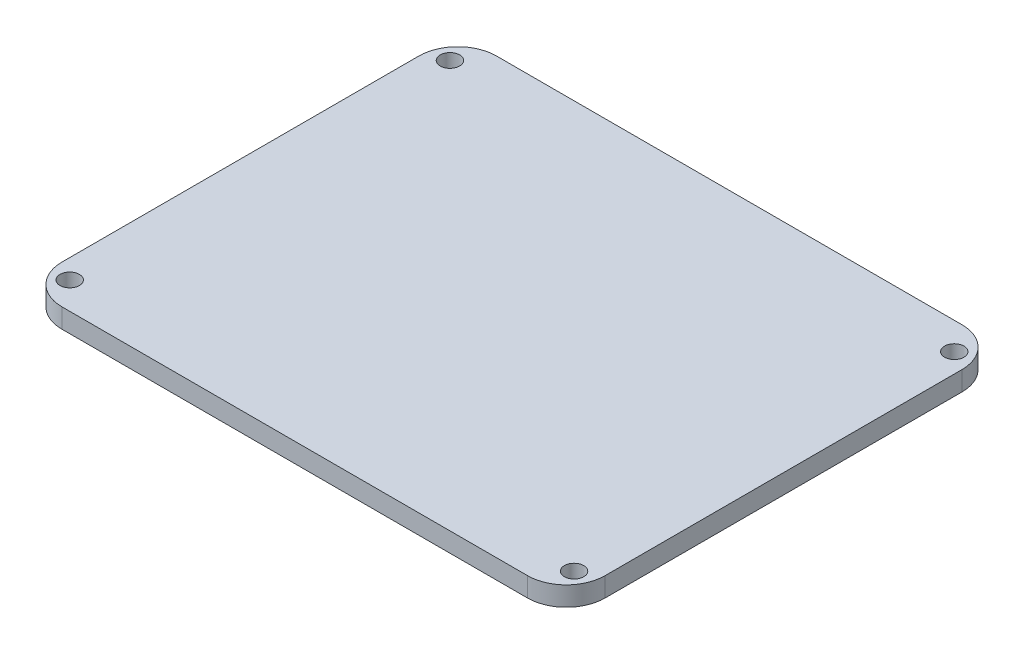
ISO-10303-21;
HEADER;
FILE_DESCRIPTION(('STEP AP214'),'2;1');
FILE_NAME('part.step','',(''),(''),'','','');
FILE_SCHEMA(('AUTOMOTIVE_DESIGN { 1 0 10303 214 1 1 1 1 }'));
ENDSEC;
DATA;
#1=APPLICATION_CONTEXT('core data for automotive mechanical design processes');
#2=APPLICATION_PROTOCOL_DEFINITION('international standard','automotive_design',2000,#1);
#3=PRODUCT_CONTEXT('',#1,'mechanical');
#4=PRODUCT('Part','Part','',(#3));
#5=PRODUCT_RELATED_PRODUCT_CATEGORY('part','',(#4));
#6=PRODUCT_DEFINITION_FORMATION('','',#4);
#7=PRODUCT_DEFINITION_CONTEXT('part definition',#1,'design');
#8=PRODUCT_DEFINITION('design','',#6,#7);
#9=PRODUCT_DEFINITION_SHAPE('','',#8);
#10=(LENGTH_UNIT() NAMED_UNIT(*) SI_UNIT(.MILLI.,.METRE.));
#11=(NAMED_UNIT(*) PLANE_ANGLE_UNIT() SI_UNIT($,.RADIAN.));
#12=(NAMED_UNIT(*) SI_UNIT($,.STERADIAN.) SOLID_ANGLE_UNIT());
#13=UNCERTAINTY_MEASURE_WITH_UNIT(LENGTH_MEASURE(1.E-05),#10,'distance_accuracy_value','');
#14=(GEOMETRIC_REPRESENTATION_CONTEXT(3) GLOBAL_UNCERTAINTY_ASSIGNED_CONTEXT((#13)) GLOBAL_UNIT_ASSIGNED_CONTEXT((#10,
#11,#12)) REPRESENTATION_CONTEXT('',''));
#15=CARTESIAN_POINT('',(0.,0.,0.));
#16=DIRECTION('',(0.,0.,1.));
#17=DIRECTION('',(1.,0.,0.));
#18=AXIS2_PLACEMENT_3D('',#15,#16,#17);
#19=CARTESIAN_POINT('',(-30.,2.5,-23.));
#20=DIRECTION('',(0.,1.,0.));
#21=DIRECTION('',(0.,0.,1.));
#22=AXIS2_PLACEMENT_3D('',#19,#20,#21);
#23=PLANE('',#22);
#24=CARTESIAN_POINT('',(32.5,2.5,24.5));
#25=DIRECTION('',(0.,1.,0.));
#26=DIRECTION('',(0.,0.,1.));
#27=AXIS2_PLACEMENT_3D('',#24,#25,#26);
#28=CIRCLE('',#27,1.25);
#29=CARTESIAN_POINT('',(32.5,2.5,25.75));
#30=VERTEX_POINT('',#29);
#31=EDGE_CURVE('E190',#30,#30,#28,.T.);
#32=ORIENTED_EDGE('',*,*,#31,.F.);
#33=EDGE_LOOP('',(#32));
#34=FACE_BOUND('',#33,.T.);
#35=CARTESIAN_POINT('',(-32.5,2.5,-24.5));
#36=DIRECTION('',(0.,1.,0.));
#37=DIRECTION('',(0.,0.,1.));
#38=AXIS2_PLACEMENT_3D('',#35,#36,#37);
#39=CIRCLE('',#38,1.25);
#40=CARTESIAN_POINT('',(-32.5,2.5,-23.25));
#41=VERTEX_POINT('',#40);
#42=EDGE_CURVE('E136',#41,#41,#39,.T.);
#43=ORIENTED_EDGE('',*,*,#42,.F.);
#44=EDGE_LOOP('',(#43));
#45=FACE_BOUND('',#44,.T.);
#46=CARTESIAN_POINT('',(-30.,2.5,-23.));
#47=DIRECTION('',(0.,1.,0.));
#48=DIRECTION('',(0.,0.,1.));
#49=AXIS2_PLACEMENT_3D('',#46,#47,#48);
#50=CIRCLE('',#49,5.);
#51=CARTESIAN_POINT('',(-30.,2.5,-28.));
#52=VERTEX_POINT('',#51);
#53=CARTESIAN_POINT('',(-35.,2.5,-23.));
#54=VERTEX_POINT('',#53);
#55=EDGE_CURVE('E147',#52,#54,#50,.T.);
#56=ORIENTED_EDGE('',*,*,#55,.T.);
#57=DIRECTION('',(0.,0.,1.));
#58=VECTOR('',#57,1.);
#59=CARTESIAN_POINT('',(-35.,2.5,-23.));
#60=LINE('',#59,#58);
#61=CARTESIAN_POINT('',(-35.,2.5,23.));
#62=VERTEX_POINT('',#61);
#63=EDGE_CURVE('E95',#54,#62,#60,.T.);
#64=ORIENTED_EDGE('',*,*,#63,.T.);
#65=CARTESIAN_POINT('',(-30.,2.5,23.));
#66=DIRECTION('',(0.,1.,0.));
#67=DIRECTION('',(0.,0.,1.));
#68=AXIS2_PLACEMENT_3D('',#65,#66,#67);
#69=CIRCLE('',#68,5.);
#70=CARTESIAN_POINT('',(-30.,2.5,28.));
#71=VERTEX_POINT('',#70);
#72=EDGE_CURVE('E162',#62,#71,#69,.T.);
#73=ORIENTED_EDGE('',*,*,#72,.T.);
#74=DIRECTION('',(1.,0.,0.));
#75=VECTOR('',#74,1.);
#76=CARTESIAN_POINT('',(-30.,2.5,28.));
#77=LINE('',#76,#75);
#78=CARTESIAN_POINT('',(30.,2.5,28.));
#79=VERTEX_POINT('',#78);
#80=EDGE_CURVE('E175',#71,#79,#77,.T.);
#81=ORIENTED_EDGE('',*,*,#80,.T.);
#82=CARTESIAN_POINT('',(30.,2.5,23.));
#83=DIRECTION('',(0.,1.,0.));
#84=DIRECTION('',(0.,0.,-1.));
#85=AXIS2_PLACEMENT_3D('',#82,#83,#84);
#86=CIRCLE('',#85,5.);
#87=CARTESIAN_POINT('',(35.,2.5,23.));
#88=VERTEX_POINT('',#87);
#89=EDGE_CURVE('E114',#79,#88,#86,.T.);
#90=ORIENTED_EDGE('',*,*,#89,.T.);
#91=DIRECTION('',(0.,0.,-1.));
#92=VECTOR('',#91,1.);
#93=CARTESIAN_POINT('',(35.,2.5,-23.));
#94=LINE('',#93,#92);
#95=CARTESIAN_POINT('',(35.,2.5,-23.));
#96=VERTEX_POINT('',#95);
#97=EDGE_CURVE('E108',#88,#96,#94,.T.);
#98=ORIENTED_EDGE('',*,*,#97,.T.);
#99=CARTESIAN_POINT('',(30.,2.5,-23.));
#100=DIRECTION('',(0.,1.,0.));
#101=DIRECTION('',(0.,0.,1.));
#102=AXIS2_PLACEMENT_3D('',#99,#100,#101);
#103=CIRCLE('',#102,5.);
#104=CARTESIAN_POINT('',(30.,2.5,-28.));
#105=VERTEX_POINT('',#104);
#106=EDGE_CURVE('E112',#96,#105,#103,.T.);
#107=ORIENTED_EDGE('',*,*,#106,.T.);
#108=DIRECTION('',(-1.,0.,0.));
#109=VECTOR('',#108,1.);
#110=CARTESIAN_POINT('',(-30.,2.5,-28.));
#111=LINE('',#110,#109);
#112=EDGE_CURVE('E52',#105,#52,#111,.T.);
#113=ORIENTED_EDGE('',*,*,#112,.T.);
#114=EDGE_LOOP('',(#56,#64,#73,#81,#90,#98,#107,#113));
#115=FACE_BOUND('',#114,.T.);
#116=CARTESIAN_POINT('',(32.5,2.5,-24.5));
#117=DIRECTION('',(0.,1.,0.));
#118=DIRECTION('',(0.,0.,1.));
#119=AXIS2_PLACEMENT_3D('',#116,#117,#118);
#120=CIRCLE('',#119,1.25);
#121=CARTESIAN_POINT('',(32.5,2.5,-23.25));
#122=VERTEX_POINT('',#121);
#123=EDGE_CURVE('E184',#122,#122,#120,.T.);
#124=ORIENTED_EDGE('',*,*,#123,.F.);
#125=EDGE_LOOP('',(#124));
#126=FACE_BOUND('',#125,.T.);
#127=CARTESIAN_POINT('',(-32.5,2.5,24.5));
#128=DIRECTION('',(0.,1.,0.));
#129=DIRECTION('',(0.,0.,1.));
#130=AXIS2_PLACEMENT_3D('',#127,#128,#129);
#131=CIRCLE('',#130,1.25);
#132=CARTESIAN_POINT('',(-32.5,2.5,25.75));
#133=VERTEX_POINT('',#132);
#134=EDGE_CURVE('E196',#133,#133,#131,.T.);
#135=ORIENTED_EDGE('',*,*,#134,.F.);
#136=EDGE_LOOP('',(#135));
#137=FACE_BOUND('',#136,.T.);
#138=ADVANCED_FACE('F35',(#34,#45,#115,#126,#137),#23,.T.);
#139=CARTESIAN_POINT('',(-30.,0.,-23.));
#140=DIRECTION('',(0.,1.,0.));
#141=DIRECTION('',(0.,0.,1.));
#142=AXIS2_PLACEMENT_3D('',#139,#140,#141);
#143=PLANE('',#142);
#144=CARTESIAN_POINT('',(-30.,0.,-23.));
#145=DIRECTION('',(0.,1.,0.));
#146=DIRECTION('',(0.,0.,1.));
#147=AXIS2_PLACEMENT_3D('',#144,#145,#146);
#148=CIRCLE('',#147,5.);
#149=CARTESIAN_POINT('',(-30.,0.,-28.));
#150=VERTEX_POINT('',#149);
#151=CARTESIAN_POINT('',(-35.,0.,-23.));
#152=VERTEX_POINT('',#151);
#153=EDGE_CURVE('E132',#150,#152,#148,.T.);
#154=ORIENTED_EDGE('',*,*,#153,.F.);
#155=DIRECTION('',(-1.,0.,0.));
#156=VECTOR('',#155,1.);
#157=CARTESIAN_POINT('',(-30.,0.,-28.));
#158=LINE('',#157,#156);
#159=CARTESIAN_POINT('',(30.,0.,-28.));
#160=VERTEX_POINT('',#159);
#161=EDGE_CURVE('E87',#160,#150,#158,.T.);
#162=ORIENTED_EDGE('',*,*,#161,.F.);
#163=CARTESIAN_POINT('',(30.,0.,-23.));
#164=DIRECTION('',(0.,1.,0.));
#165=DIRECTION('',(0.,0.,1.));
#166=AXIS2_PLACEMENT_3D('',#163,#164,#165);
#167=CIRCLE('',#166,5.);
#168=CARTESIAN_POINT('',(35.,0.,-23.));
#169=VERTEX_POINT('',#168);
#170=EDGE_CURVE('E81',#169,#160,#167,.T.);
#171=ORIENTED_EDGE('',*,*,#170,.F.);
#172=DIRECTION('',(0.,0.,-1.));
#173=VECTOR('',#172,1.);
#174=CARTESIAN_POINT('',(35.,0.,-23.));
#175=LINE('',#174,#173);
#176=CARTESIAN_POINT('',(35.,0.,23.));
#177=VERTEX_POINT('',#176);
#178=EDGE_CURVE('E122',#177,#169,#175,.T.);
#179=ORIENTED_EDGE('',*,*,#178,.F.);
#180=CARTESIAN_POINT('',(30.,0.,23.));
#181=DIRECTION('',(0.,1.,0.));
#182=DIRECTION('',(0.,0.,-1.));
#183=AXIS2_PLACEMENT_3D('',#180,#181,#182);
#184=CIRCLE('',#183,5.);
#185=CARTESIAN_POINT('',(30.,0.,28.));
#186=VERTEX_POINT('',#185);
#187=EDGE_CURVE('E142',#186,#177,#184,.T.);
#188=ORIENTED_EDGE('',*,*,#187,.F.);
#189=DIRECTION('',(1.,0.,0.));
#190=VECTOR('',#189,1.);
#191=CARTESIAN_POINT('',(-30.,0.,28.));
#192=LINE('',#191,#190);
#193=CARTESIAN_POINT('',(-30.,0.,28.));
#194=VERTEX_POINT('',#193);
#195=EDGE_CURVE('E140',#194,#186,#192,.T.);
#196=ORIENTED_EDGE('',*,*,#195,.F.);
#197=CARTESIAN_POINT('',(-30.,0.,23.));
#198=DIRECTION('',(0.,1.,0.));
#199=DIRECTION('',(0.,0.,1.));
#200=AXIS2_PLACEMENT_3D('',#197,#198,#199);
#201=CIRCLE('',#200,5.);
#202=CARTESIAN_POINT('',(-35.,0.,23.));
#203=VERTEX_POINT('',#202);
#204=EDGE_CURVE('E138',#203,#194,#201,.T.);
#205=ORIENTED_EDGE('',*,*,#204,.F.);
#206=DIRECTION('',(0.,0.,1.));
#207=VECTOR('',#206,1.);
#208=CARTESIAN_POINT('',(-35.,0.,-23.));
#209=LINE('',#208,#207);
#210=EDGE_CURVE('E135',#152,#203,#209,.T.);
#211=ORIENTED_EDGE('',*,*,#210,.F.);
#212=EDGE_LOOP('',(#154,#162,#171,#179,#188,#196,#205,#211));
#213=FACE_BOUND('',#212,.T.);
#214=CARTESIAN_POINT('',(-32.5,0.,-24.5));
#215=DIRECTION('',(0.,1.,0.));
#216=DIRECTION('',(0.,0.,1.));
#217=AXIS2_PLACEMENT_3D('',#214,#215,#216);
#218=CIRCLE('',#217,1.25);
#219=CARTESIAN_POINT('',(-32.5,0.,-23.25));
#220=VERTEX_POINT('',#219);
#221=EDGE_CURVE('E181',#220,#220,#218,.T.);
#222=ORIENTED_EDGE('',*,*,#221,.T.);
#223=EDGE_LOOP('',(#222));
#224=FACE_BOUND('',#223,.T.);
#225=CARTESIAN_POINT('',(32.5,0.,-24.5));
#226=DIRECTION('',(0.,1.,0.));
#227=DIRECTION('',(0.,0.,1.));
#228=AXIS2_PLACEMENT_3D('',#225,#226,#227);
#229=CIRCLE('',#228,1.25);
#230=CARTESIAN_POINT('',(32.5,0.,-23.25));
#231=VERTEX_POINT('',#230);
#232=EDGE_CURVE('E187',#231,#231,#229,.T.);
#233=ORIENTED_EDGE('',*,*,#232,.T.);
#234=EDGE_LOOP('',(#233));
#235=FACE_BOUND('',#234,.T.);
#236=CARTESIAN_POINT('',(32.5,0.,24.5));
#237=DIRECTION('',(0.,1.,0.));
#238=DIRECTION('',(0.,0.,1.));
#239=AXIS2_PLACEMENT_3D('',#236,#237,#238);
#240=CIRCLE('',#239,1.25);
#241=CARTESIAN_POINT('',(32.5,0.,25.75));
#242=VERTEX_POINT('',#241);
#243=EDGE_CURVE('E193',#242,#242,#240,.T.);
#244=ORIENTED_EDGE('',*,*,#243,.T.);
#245=EDGE_LOOP('',(#244));
#246=FACE_BOUND('',#245,.T.);
#247=CARTESIAN_POINT('',(-32.5,0.,24.5));
#248=DIRECTION('',(0.,1.,0.));
#249=DIRECTION('',(0.,0.,1.));
#250=AXIS2_PLACEMENT_3D('',#247,#248,#249);
#251=CIRCLE('',#250,1.25);
#252=CARTESIAN_POINT('',(-32.5,0.,25.75));
#253=VERTEX_POINT('',#252);
#254=EDGE_CURVE('E199',#253,#253,#251,.T.);
#255=ORIENTED_EDGE('',*,*,#254,.T.);
#256=EDGE_LOOP('',(#255));
#257=FACE_BOUND('',#256,.T.);
#258=ADVANCED_FACE('F166',(#213,#224,#235,#246,#257),#143,.F.);
#259=CARTESIAN_POINT('',(-30.,2.5,-23.));
#260=DIRECTION('',(0.,-1.,0.));
#261=DIRECTION('',(0.,0.,-1.));
#262=AXIS2_PLACEMENT_3D('',#259,#260,#261);
#263=CYLINDRICAL_SURFACE('',#262,5.);
#264=ORIENTED_EDGE('',*,*,#153,.T.);
#265=DIRECTION('',(0.,-1.,0.));
#266=VECTOR('',#265,1.);
#267=CARTESIAN_POINT('',(-35.,2.5,-23.));
#268=LINE('',#267,#266);
#269=EDGE_CURVE('E11',#54,#152,#268,.T.);
#270=ORIENTED_EDGE('',*,*,#269,.F.);
#271=ORIENTED_EDGE('',*,*,#55,.F.);
#272=DIRECTION('',(0.,-1.,0.));
#273=VECTOR('',#272,1.);
#274=CARTESIAN_POINT('',(-30.,2.5,-28.));
#275=LINE('',#274,#273);
#276=EDGE_CURVE('E128',#52,#150,#275,.T.);
#277=ORIENTED_EDGE('',*,*,#276,.T.);
#278=EDGE_LOOP('',(#264,#270,#271,#277));
#279=FACE_BOUND('',#278,.T.);
#280=ADVANCED_FACE('F37',(#279),#263,.T.);
#281=CARTESIAN_POINT('',(-35.,2.5,-23.));
#282=DIRECTION('',(1.,0.,0.));
#283=DIRECTION('',(0.,0.,-1.));
#284=AXIS2_PLACEMENT_3D('',#281,#282,#283);
#285=PLANE('',#284);
#286=ORIENTED_EDGE('',*,*,#210,.T.);
#287=DIRECTION('',(0.,-1.,0.));
#288=VECTOR('',#287,1.);
#289=CARTESIAN_POINT('',(-35.,2.5,23.));
#290=LINE('',#289,#288);
#291=EDGE_CURVE('E44',#62,#203,#290,.T.);
#292=ORIENTED_EDGE('',*,*,#291,.F.);
#293=ORIENTED_EDGE('',*,*,#63,.F.);
#294=ORIENTED_EDGE('',*,*,#269,.T.);
#295=EDGE_LOOP('',(#286,#292,#293,#294));
#296=FACE_BOUND('',#295,.T.);
#297=ADVANCED_FACE('F233',(#296),#285,.F.);
#298=CARTESIAN_POINT('',(-30.,2.5,23.));
#299=DIRECTION('',(0.,-1.,0.));
#300=DIRECTION('',(0.,0.,-1.));
#301=AXIS2_PLACEMENT_3D('',#298,#299,#300);
#302=CYLINDRICAL_SURFACE('',#301,5.);
#303=ORIENTED_EDGE('',*,*,#204,.T.);
#304=DIRECTION('',(0.,-1.,0.));
#305=VECTOR('',#304,1.);
#306=CARTESIAN_POINT('',(-30.,2.5,28.));
#307=LINE('',#306,#305);
#308=EDGE_CURVE('E154',#71,#194,#307,.T.);
#309=ORIENTED_EDGE('',*,*,#308,.F.);
#310=ORIENTED_EDGE('',*,*,#72,.F.);
#311=ORIENTED_EDGE('',*,*,#291,.T.);
#312=EDGE_LOOP('',(#303,#309,#310,#311));
#313=FACE_BOUND('',#312,.T.);
#314=ADVANCED_FACE('F160',(#313),#302,.T.);
#315=CARTESIAN_POINT('',(-30.,2.5,28.));
#316=DIRECTION('',(0.,0.,-1.));
#317=DIRECTION('',(-1.,0.,0.));
#318=AXIS2_PLACEMENT_3D('',#315,#316,#317);
#319=PLANE('',#318);
#320=ORIENTED_EDGE('',*,*,#195,.T.);
#321=DIRECTION('',(0.,-1.,0.));
#322=VECTOR('',#321,1.);
#323=CARTESIAN_POINT('',(30.,2.5,28.));
#324=LINE('',#323,#322);
#325=EDGE_CURVE('E151',#79,#186,#324,.T.);
#326=ORIENTED_EDGE('',*,*,#325,.F.);
#327=ORIENTED_EDGE('',*,*,#80,.F.);
#328=ORIENTED_EDGE('',*,*,#308,.T.);
#329=EDGE_LOOP('',(#320,#326,#327,#328));
#330=FACE_BOUND('',#329,.T.);
#331=ADVANCED_FACE('F171',(#330),#319,.F.);
#332=CARTESIAN_POINT('',(30.,2.5,23.));
#333=DIRECTION('',(0.,-1.,0.));
#334=DIRECTION('',(0.,0.,-1.));
#335=AXIS2_PLACEMENT_3D('',#332,#333,#334);
#336=CYLINDRICAL_SURFACE('',#335,5.);
#337=ORIENTED_EDGE('',*,*,#187,.T.);
#338=DIRECTION('',(0.,-1.,0.));
#339=VECTOR('',#338,1.);
#340=CARTESIAN_POINT('',(35.,2.5,23.));
#341=LINE('',#340,#339);
#342=EDGE_CURVE('E123',#88,#177,#341,.T.);
#343=ORIENTED_EDGE('',*,*,#342,.F.);
#344=ORIENTED_EDGE('',*,*,#89,.F.);
#345=ORIENTED_EDGE('',*,*,#325,.T.);
#346=EDGE_LOOP('',(#337,#343,#344,#345));
#347=FACE_BOUND('',#346,.T.);
#348=ADVANCED_FACE('F174',(#347),#336,.T.);
#349=CARTESIAN_POINT('',(35.,2.5,-23.));
#350=DIRECTION('',(-1.,0.,0.));
#351=DIRECTION('',(0.,0.,1.));
#352=AXIS2_PLACEMENT_3D('',#349,#350,#351);
#353=PLANE('',#352);
#354=ORIENTED_EDGE('',*,*,#178,.T.);
#355=DIRECTION('',(0.,-1.,0.));
#356=VECTOR('',#355,1.);
#357=CARTESIAN_POINT('',(35.,2.5,-23.));
#358=LINE('',#357,#356);
#359=EDGE_CURVE('E119',#96,#169,#358,.T.);
#360=ORIENTED_EDGE('',*,*,#359,.F.);
#361=ORIENTED_EDGE('',*,*,#97,.F.);
#362=ORIENTED_EDGE('',*,*,#342,.T.);
#363=EDGE_LOOP('',(#354,#360,#361,#362));
#364=FACE_BOUND('',#363,.T.);
#365=ADVANCED_FACE('F120',(#364),#353,.F.);
#366=CARTESIAN_POINT('',(30.,2.5,-23.));
#367=DIRECTION('',(0.,-1.,0.));
#368=DIRECTION('',(0.,0.,-1.));
#369=AXIS2_PLACEMENT_3D('',#366,#367,#368);
#370=CYLINDRICAL_SURFACE('',#369,5.);
#371=ORIENTED_EDGE('',*,*,#170,.T.);
#372=DIRECTION('',(0.,-1.,0.));
#373=VECTOR('',#372,1.);
#374=CARTESIAN_POINT('',(30.,2.5,-28.));
#375=LINE('',#374,#373);
#376=EDGE_CURVE('E124',#105,#160,#375,.T.);
#377=ORIENTED_EDGE('',*,*,#376,.F.);
#378=ORIENTED_EDGE('',*,*,#106,.F.);
#379=ORIENTED_EDGE('',*,*,#359,.T.);
#380=EDGE_LOOP('',(#371,#377,#378,#379));
#381=FACE_BOUND('',#380,.T.);
#382=ADVANCED_FACE('F126',(#381),#370,.T.);
#383=CARTESIAN_POINT('',(-30.,2.5,-28.));
#384=DIRECTION('',(0.,0.,1.));
#385=DIRECTION('',(1.,0.,0.));
#386=AXIS2_PLACEMENT_3D('',#383,#384,#385);
#387=PLANE('',#386);
#388=ORIENTED_EDGE('',*,*,#161,.T.);
#389=ORIENTED_EDGE('',*,*,#276,.F.);
#390=ORIENTED_EDGE('',*,*,#112,.F.);
#391=ORIENTED_EDGE('',*,*,#376,.T.);
#392=EDGE_LOOP('',(#388,#389,#390,#391));
#393=FACE_BOUND('',#392,.T.);
#394=ADVANCED_FACE('F221',(#393),#387,.F.);
#395=CARTESIAN_POINT('',(-32.5,2.5,-24.5));
#396=DIRECTION('',(0.,-1.,0.));
#397=DIRECTION('',(0.,0.,-1.));
#398=AXIS2_PLACEMENT_3D('',#395,#396,#397);
#399=CYLINDRICAL_SURFACE('',#398,1.25);
#400=ORIENTED_EDGE('',*,*,#42,.T.);
#401=EDGE_LOOP('',(#400));
#402=FACE_BOUND('',#401,.T.);
#403=ORIENTED_EDGE('',*,*,#221,.F.);
#404=EDGE_LOOP('',(#403));
#405=FACE_BOUND('',#404,.T.);
#406=ADVANCED_FACE('F218',(#402,#405),#399,.F.);
#407=CARTESIAN_POINT('',(32.5,2.5,-24.5));
#408=DIRECTION('',(0.,-1.,0.));
#409=DIRECTION('',(0.,0.,-1.));
#410=AXIS2_PLACEMENT_3D('',#407,#408,#409);
#411=CYLINDRICAL_SURFACE('',#410,1.25);
#412=ORIENTED_EDGE('',*,*,#123,.T.);
#413=EDGE_LOOP('',(#412));
#414=FACE_BOUND('',#413,.T.);
#415=ORIENTED_EDGE('',*,*,#232,.F.);
#416=EDGE_LOOP('',(#415));
#417=FACE_BOUND('',#416,.T.);
#418=ADVANCED_FACE('F297',(#414,#417),#411,.F.);
#419=CARTESIAN_POINT('',(32.5,2.5,24.5));
#420=DIRECTION('',(0.,-1.,0.));
#421=DIRECTION('',(0.,0.,-1.));
#422=AXIS2_PLACEMENT_3D('',#419,#420,#421);
#423=CYLINDRICAL_SURFACE('',#422,1.25);
#424=ORIENTED_EDGE('',*,*,#31,.T.);
#425=EDGE_LOOP('',(#424));
#426=FACE_BOUND('',#425,.T.);
#427=ORIENTED_EDGE('',*,*,#243,.F.);
#428=EDGE_LOOP('',(#427));
#429=FACE_BOUND('',#428,.T.);
#430=ADVANCED_FACE('F305',(#426,#429),#423,.F.);
#431=CARTESIAN_POINT('',(-32.5,2.5,24.5));
#432=DIRECTION('',(0.,-1.,0.));
#433=DIRECTION('',(0.,0.,-1.));
#434=AXIS2_PLACEMENT_3D('',#431,#432,#433);
#435=CYLINDRICAL_SURFACE('',#434,1.25);
#436=ORIENTED_EDGE('',*,*,#134,.T.);
#437=EDGE_LOOP('',(#436));
#438=FACE_BOUND('',#437,.T.);
#439=ORIENTED_EDGE('',*,*,#254,.F.);
#440=EDGE_LOOP('',(#439));
#441=FACE_BOUND('',#440,.T.);
#442=ADVANCED_FACE('F205',(#438,#441),#435,.F.);
#443=CLOSED_SHELL('',(#138,#258,#280,#297,#314,#331,#348,#365,#382,#394,#406,#418,#430,#442));
#444=MANIFOLD_SOLID_BREP('B2',#443);
#445=ADVANCED_BREP_SHAPE_REPRESENTATION('',(#18,#444),#14);
#446=SHAPE_DEFINITION_REPRESENTATION(#9,#445);
ENDSEC;
END-ISO-10303-21;
